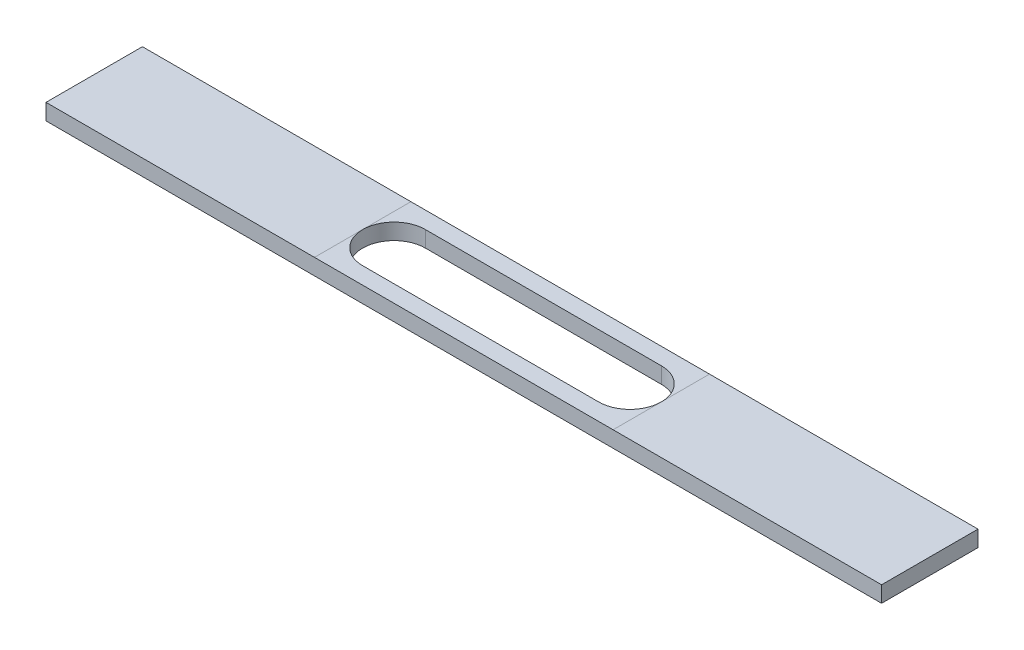
ISO-10303-21;
HEADER;
FILE_DESCRIPTION(('STEP AP214'),'2;1');
FILE_NAME('part.step','',(''),(''),'','','');
FILE_SCHEMA(('AUTOMOTIVE_DESIGN { 1 0 10303 214 1 1 1 1 }'));
ENDSEC;
DATA;
#1=APPLICATION_CONTEXT('core data for automotive mechanical design processes');
#2=APPLICATION_PROTOCOL_DEFINITION('international standard','automotive_design',2000,#1);
#3=PRODUCT_CONTEXT('',#1,'mechanical');
#4=PRODUCT('Part','Part','',(#3));
#5=PRODUCT_RELATED_PRODUCT_CATEGORY('part','',(#4));
#6=PRODUCT_DEFINITION_FORMATION('','',#4);
#7=PRODUCT_DEFINITION_CONTEXT('part definition',#1,'design');
#8=PRODUCT_DEFINITION('design','',#6,#7);
#9=PRODUCT_DEFINITION_SHAPE('','',#8);
#10=(LENGTH_UNIT() NAMED_UNIT(*) SI_UNIT(.MILLI.,.METRE.));
#11=(NAMED_UNIT(*) PLANE_ANGLE_UNIT() SI_UNIT($,.RADIAN.));
#12=(NAMED_UNIT(*) SI_UNIT($,.STERADIAN.) SOLID_ANGLE_UNIT());
#13=UNCERTAINTY_MEASURE_WITH_UNIT(LENGTH_MEASURE(1.E-05),#10,'distance_accuracy_value','');
#14=(GEOMETRIC_REPRESENTATION_CONTEXT(3) GLOBAL_UNCERTAINTY_ASSIGNED_CONTEXT((#13)) GLOBAL_UNIT_ASSIGNED_CONTEXT((#10,
#11,#12)) REPRESENTATION_CONTEXT('',''));
#15=CARTESIAN_POINT('',(0.,0.,0.));
#16=DIRECTION('',(0.,0.,1.));
#17=DIRECTION('',(1.,0.,0.));
#18=AXIS2_PLACEMENT_3D('',#15,#16,#17);
#19=CARTESIAN_POINT('',(0.,3.175,0.));
#20=DIRECTION('',(0.,1.,0.));
#21=DIRECTION('',(0.,0.,1.));
#22=AXIS2_PLACEMENT_3D('',#19,#20,#21);
#23=PLANE('',#22);
#24=DIRECTION('',(-1.,0.,0.));
#25=VECTOR('',#24,1.);
#26=CARTESIAN_POINT('',(-23.31,3.175,-6.19));
#27=LINE('',#26,#25);
#28=CARTESIAN_POINT('',(23.31,3.175,-6.19000000000001));
#29=VERTEX_POINT('',#28);
#30=CARTESIAN_POINT('',(-23.31,3.175,-6.19));
#31=VERTEX_POINT('',#30);
#32=EDGE_CURVE('E141',#29,#31,#27,.T.);
#33=ORIENTED_EDGE('',*,*,#32,.F.);
#34=CARTESIAN_POINT('',(23.31,3.175,0.));
#35=DIRECTION('',(0.,1.,0.));
#36=DIRECTION('',(0.,0.,1.));
#37=AXIS2_PLACEMENT_3D('',#34,#35,#36);
#38=CIRCLE('',#37,6.19);
#39=CARTESIAN_POINT('',(29.5,3.175,0.));
#40=VERTEX_POINT('',#39);
#41=EDGE_CURVE('E153',#40,#29,#38,.T.);
#42=ORIENTED_EDGE('',*,*,#41,.F.);
#43=DIRECTION('',(0.,0.,-1.));
#44=VECTOR('',#43,1.);
#45=CARTESIAN_POINT('',(29.5,3.175,0.));
#46=LINE('',#45,#44);
#47=CARTESIAN_POINT('',(29.5,3.175,-9.525));
#48=VERTEX_POINT('',#47);
#49=EDGE_CURVE('E48',#40,#48,#46,.T.);
#50=ORIENTED_EDGE('',*,*,#49,.T.);
#51=DIRECTION('',(-1.,0.,0.));
#52=VECTOR('',#51,1.);
#53=CARTESIAN_POINT('',(82.5500000000003,3.175,-9.52500000000001));
#54=LINE('',#53,#52);
#55=CARTESIAN_POINT('',(-29.5,3.175,-9.52499999999999));
#56=VERTEX_POINT('',#55);
#57=EDGE_CURVE('E171',#48,#56,#54,.T.);
#58=ORIENTED_EDGE('',*,*,#57,.T.);
#59=DIRECTION('',(0.,0.,-1.));
#60=VECTOR('',#59,1.);
#61=CARTESIAN_POINT('',(-29.5,3.175,0.));
#62=LINE('',#61,#60);
#63=CARTESIAN_POINT('',(-29.5,3.175,0.));
#64=VERTEX_POINT('',#63);
#65=EDGE_CURVE('E197',#64,#56,#62,.T.);
#66=ORIENTED_EDGE('',*,*,#65,.F.);
#67=CARTESIAN_POINT('',(-23.31,3.175,0.));
#68=DIRECTION('',(0.,1.,0.));
#69=DIRECTION('',(0.,0.,1.));
#70=AXIS2_PLACEMENT_3D('',#67,#68,#69);
#71=CIRCLE('',#70,6.19);
#72=EDGE_CURVE('E149',#31,#64,#71,.T.);
#73=ORIENTED_EDGE('',*,*,#72,.F.);
#74=EDGE_LOOP('',(#33,#42,#50,#58,#66,#73));
#75=FACE_BOUND('',#74,.T.);
#76=ADVANCED_FACE('F39',(#75),#23,.T.);
#77=CARTESIAN_POINT('',(-23.31,3.175,6.19));
#78=VERTEX_POINT('',#77);
#79=EDGE_CURVE('E128',#64,#78,#71,.T.);
#80=ORIENTED_EDGE('',*,*,#79,.F.);
#81=CARTESIAN_POINT('',(-29.5,3.175,9.52500000000001));
#82=VERTEX_POINT('',#81);
#83=EDGE_CURVE('E198',#82,#64,#62,.T.);
#84=ORIENTED_EDGE('',*,*,#83,.F.);
#85=DIRECTION('',(-1.,0.,0.));
#86=VECTOR('',#85,1.);
#87=CARTESIAN_POINT('',(82.5500000000003,3.175,9.525));
#88=LINE('',#87,#86);
#89=CARTESIAN_POINT('',(29.5,3.175,9.525));
#90=VERTEX_POINT('',#89);
#91=EDGE_CURVE('E179',#90,#82,#88,.T.);
#92=ORIENTED_EDGE('',*,*,#91,.F.);
#93=EDGE_CURVE('E11',#90,#40,#46,.T.);
#94=ORIENTED_EDGE('',*,*,#93,.T.);
#95=CARTESIAN_POINT('',(23.31,3.175,6.19));
#96=VERTEX_POINT('',#95);
#97=EDGE_CURVE('E144',#96,#40,#38,.T.);
#98=ORIENTED_EDGE('',*,*,#97,.F.);
#99=DIRECTION('',(1.,0.,0.));
#100=VECTOR('',#99,1.);
#101=CARTESIAN_POINT('',(-23.31,3.175,6.19));
#102=LINE('',#101,#100);
#103=EDGE_CURVE('E151',#78,#96,#102,.T.);
#104=ORIENTED_EDGE('',*,*,#103,.F.);
#105=EDGE_LOOP('',(#80,#84,#92,#94,#98,#104));
#106=FACE_BOUND('',#105,.T.);
#107=ADVANCED_FACE('F234',(#106),#23,.T.);
#108=CARTESIAN_POINT('',(-82.5499999999997,3.175,9.52500000000001));
#109=VERTEX_POINT('',#108);
#110=EDGE_CURVE('E174',#82,#109,#88,.T.);
#111=ORIENTED_EDGE('',*,*,#110,.F.);
#112=ORIENTED_EDGE('',*,*,#83,.T.);
#113=ORIENTED_EDGE('',*,*,#65,.T.);
#114=CARTESIAN_POINT('',(-82.5499999999997,3.175,-9.52499999999999));
#115=VERTEX_POINT('',#114);
#116=EDGE_CURVE('E165',#56,#115,#54,.T.);
#117=ORIENTED_EDGE('',*,*,#116,.T.);
#118=DIRECTION('',(0.,0.,-1.));
#119=VECTOR('',#118,1.);
#120=CARTESIAN_POINT('',(-82.5499999999997,3.175,9.52500000000001));
#121=LINE('',#120,#119);
#122=EDGE_CURVE('E170',#109,#115,#121,.T.);
#123=ORIENTED_EDGE('',*,*,#122,.F.);
#124=EDGE_LOOP('',(#111,#112,#113,#117,#123));
#125=FACE_BOUND('',#124,.T.);
#126=ADVANCED_FACE('F212',(#125),#23,.T.);
#127=CARTESIAN_POINT('',(82.5500000000003,3.175,9.525));
#128=DIRECTION('',(-1.,0.,0.));
#129=DIRECTION('',(0.,0.,1.));
#130=AXIS2_PLACEMENT_3D('',#127,#128,#129);
#131=PLANE('',#130);
#132=DIRECTION('',(0.,0.,-1.));
#133=VECTOR('',#132,1.);
#134=CARTESIAN_POINT('',(82.5500000000003,0.,9.525));
#135=LINE('',#134,#133);
#136=CARTESIAN_POINT('',(82.5500000000003,0.,9.525));
#137=VERTEX_POINT('',#136);
#138=CARTESIAN_POINT('',(82.5500000000003,0.,-9.52500000000001));
#139=VERTEX_POINT('',#138);
#140=EDGE_CURVE('E157',#137,#139,#135,.T.);
#141=ORIENTED_EDGE('',*,*,#140,.T.);
#142=DIRECTION('',(0.,-1.,0.));
#143=VECTOR('',#142,1.);
#144=CARTESIAN_POINT('',(82.5500000000003,3.175,-9.52500000000001));
#145=LINE('',#144,#143);
#146=CARTESIAN_POINT('',(82.5500000000003,3.175,-9.52500000000001));
#147=VERTEX_POINT('',#146);
#148=EDGE_CURVE('E195',#147,#139,#145,.T.);
#149=ORIENTED_EDGE('',*,*,#148,.F.);
#150=DIRECTION('',(0.,0.,-1.));
#151=VECTOR('',#150,1.);
#152=CARTESIAN_POINT('',(82.5500000000003,3.175,9.525));
#153=LINE('',#152,#151);
#154=CARTESIAN_POINT('',(82.5500000000003,3.175,9.525));
#155=VERTEX_POINT('',#154);
#156=EDGE_CURVE('E162',#155,#147,#153,.T.);
#157=ORIENTED_EDGE('',*,*,#156,.F.);
#158=DIRECTION('',(0.,-1.,0.));
#159=VECTOR('',#158,1.);
#160=CARTESIAN_POINT('',(82.5500000000003,3.175,9.525));
#161=LINE('',#160,#159);
#162=EDGE_CURVE('E178',#155,#137,#161,.T.);
#163=ORIENTED_EDGE('',*,*,#162,.T.);
#164=EDGE_LOOP('',(#141,#149,#157,#163));
#165=FACE_BOUND('',#164,.T.);
#166=ADVANCED_FACE('F41',(#165),#131,.F.);
#167=CARTESIAN_POINT('',(82.5500000000003,3.175,-9.52500000000001));
#168=DIRECTION('',(0.,0.,1.));
#169=DIRECTION('',(1.,0.,0.));
#170=AXIS2_PLACEMENT_3D('',#167,#168,#169);
#171=PLANE('',#170);
#172=DIRECTION('',(-1.,0.,0.));
#173=VECTOR('',#172,1.);
#174=CARTESIAN_POINT('',(82.5500000000003,0.,-9.52500000000001));
#175=LINE('',#174,#173);
#176=CARTESIAN_POINT('',(-82.5499999999997,0.,-9.52499999999999));
#177=VERTEX_POINT('',#176);
#178=EDGE_CURVE('E182',#139,#177,#175,.T.);
#179=ORIENTED_EDGE('',*,*,#178,.T.);
#180=DIRECTION('',(0.,-1.,0.));
#181=VECTOR('',#180,1.);
#182=CARTESIAN_POINT('',(-82.5499999999997,3.175,-9.52499999999999));
#183=LINE('',#182,#181);
#184=EDGE_CURVE('E193',#115,#177,#183,.T.);
#185=ORIENTED_EDGE('',*,*,#184,.F.);
#186=ORIENTED_EDGE('',*,*,#116,.F.);
#187=ORIENTED_EDGE('',*,*,#57,.F.);
#188=EDGE_CURVE('E167',#147,#48,#54,.T.);
#189=ORIENTED_EDGE('',*,*,#188,.F.);
#190=ORIENTED_EDGE('',*,*,#148,.T.);
#191=EDGE_LOOP('',(#179,#185,#186,#187,#189,#190));
#192=FACE_BOUND('',#191,.T.);
#193=ADVANCED_FACE('F223',(#192),#171,.F.);
#194=CARTESIAN_POINT('',(-82.5499999999997,3.175,9.52500000000001));
#195=DIRECTION('',(-1.,0.,0.));
#196=DIRECTION('',(0.,0.,1.));
#197=AXIS2_PLACEMENT_3D('',#194,#195,#196);
#198=PLANE('',#197);
#199=DIRECTION('',(0.,0.,-1.));
#200=VECTOR('',#199,1.);
#201=CARTESIAN_POINT('',(-82.5499999999997,0.,9.52500000000001));
#202=LINE('',#201,#200);
#203=CARTESIAN_POINT('',(-82.5499999999997,0.,9.52500000000001));
#204=VERTEX_POINT('',#203);
#205=EDGE_CURVE('E185',#204,#177,#202,.T.);
#206=ORIENTED_EDGE('',*,*,#205,.F.);
#207=DIRECTION('',(0.,-1.,0.));
#208=VECTOR('',#207,1.);
#209=CARTESIAN_POINT('',(-82.5499999999997,3.175,9.52500000000001));
#210=LINE('',#209,#208);
#211=EDGE_CURVE('E191',#109,#204,#210,.T.);
#212=ORIENTED_EDGE('',*,*,#211,.F.);
#213=ORIENTED_EDGE('',*,*,#122,.T.);
#214=ORIENTED_EDGE('',*,*,#184,.T.);
#215=EDGE_LOOP('',(#206,#212,#213,#214));
#216=FACE_BOUND('',#215,.T.);
#217=ADVANCED_FACE('F227',(#216),#198,.T.);
#218=CARTESIAN_POINT('',(82.5500000000003,3.175,9.525));
#219=DIRECTION('',(0.,0.,1.));
#220=DIRECTION('',(1.,0.,0.));
#221=AXIS2_PLACEMENT_3D('',#218,#219,#220);
#222=PLANE('',#221);
#223=DIRECTION('',(-1.,0.,0.));
#224=VECTOR('',#223,1.);
#225=CARTESIAN_POINT('',(82.5500000000003,0.,9.525));
#226=LINE('',#225,#224);
#227=EDGE_CURVE('E166',#137,#204,#226,.T.);
#228=ORIENTED_EDGE('',*,*,#227,.F.);
#229=ORIENTED_EDGE('',*,*,#162,.F.);
#230=EDGE_CURVE('E175',#155,#90,#88,.T.);
#231=ORIENTED_EDGE('',*,*,#230,.T.);
#232=ORIENTED_EDGE('',*,*,#91,.T.);
#233=ORIENTED_EDGE('',*,*,#110,.T.);
#234=ORIENTED_EDGE('',*,*,#211,.T.);
#235=EDGE_LOOP('',(#228,#229,#231,#232,#233,#234));
#236=FACE_BOUND('',#235,.T.);
#237=ADVANCED_FACE('F231',(#236),#222,.T.);
#238=ORIENTED_EDGE('',*,*,#93,.F.);
#239=ORIENTED_EDGE('',*,*,#230,.F.);
#240=ORIENTED_EDGE('',*,*,#156,.T.);
#241=ORIENTED_EDGE('',*,*,#188,.T.);
#242=ORIENTED_EDGE('',*,*,#49,.F.);
#243=EDGE_LOOP('',(#238,#239,#240,#241,#242));
#244=FACE_BOUND('',#243,.T.);
#245=ADVANCED_FACE('F238',(#244),#23,.T.);
#246=CARTESIAN_POINT('',(0.,0.,0.));
#247=DIRECTION('',(0.,1.,0.));
#248=DIRECTION('',(0.,0.,1.));
#249=AXIS2_PLACEMENT_3D('',#246,#247,#248);
#250=PLANE('',#249);
#251=DIRECTION('',(-1.,0.,0.));
#252=VECTOR('',#251,1.);
#253=CARTESIAN_POINT('',(-23.31,0.,-6.19));
#254=LINE('',#253,#252);
#255=CARTESIAN_POINT('',(23.31,0.,-6.19000000000001));
#256=VERTEX_POINT('',#255);
#257=CARTESIAN_POINT('',(-23.31,0.,-6.19));
#258=VERTEX_POINT('',#257);
#259=EDGE_CURVE('E131',#256,#258,#254,.T.);
#260=ORIENTED_EDGE('',*,*,#259,.T.);
#261=CARTESIAN_POINT('',(-23.31,0.,0.));
#262=DIRECTION('',(0.,1.,0.));
#263=DIRECTION('',(0.,0.,1.));
#264=AXIS2_PLACEMENT_3D('',#261,#262,#263);
#265=CIRCLE('',#264,6.19);
#266=CARTESIAN_POINT('',(-23.31,0.,6.19));
#267=VERTEX_POINT('',#266);
#268=EDGE_CURVE('E125',#258,#267,#265,.T.);
#269=ORIENTED_EDGE('',*,*,#268,.T.);
#270=DIRECTION('',(1.,0.,0.));
#271=VECTOR('',#270,1.);
#272=CARTESIAN_POINT('',(-23.31,0.,6.19));
#273=LINE('',#272,#271);
#274=CARTESIAN_POINT('',(23.31,0.,6.18999999999999));
#275=VERTEX_POINT('',#274);
#276=EDGE_CURVE('E134',#267,#275,#273,.T.);
#277=ORIENTED_EDGE('',*,*,#276,.T.);
#278=CARTESIAN_POINT('',(23.31,0.,0.));
#279=DIRECTION('',(0.,1.,0.));
#280=DIRECTION('',(0.,0.,1.));
#281=AXIS2_PLACEMENT_3D('',#278,#279,#280);
#282=CIRCLE('',#281,6.19);
#283=EDGE_CURVE('E63',#275,#256,#282,.T.);
#284=ORIENTED_EDGE('',*,*,#283,.T.);
#285=EDGE_LOOP('',(#260,#269,#277,#284));
#286=FACE_BOUND('',#285,.T.);
#287=ORIENTED_EDGE('',*,*,#140,.F.);
#288=ORIENTED_EDGE('',*,*,#227,.T.);
#289=ORIENTED_EDGE('',*,*,#205,.T.);
#290=ORIENTED_EDGE('',*,*,#178,.F.);
#291=EDGE_LOOP('',(#287,#288,#289,#290));
#292=FACE_BOUND('',#291,.T.);
#293=ADVANCED_FACE('F138',(#286,#292),#250,.F.);
#294=CARTESIAN_POINT('',(-23.31,0.,0.));
#295=DIRECTION('',(0.,1.,0.));
#296=DIRECTION('',(0.,0.,1.));
#297=AXIS2_PLACEMENT_3D('',#294,#295,#296);
#298=CYLINDRICAL_SURFACE('',#297,6.19);
#299=ORIENTED_EDGE('',*,*,#72,.T.);
#300=ORIENTED_EDGE('',*,*,#79,.T.);
#301=DIRECTION('',(0.,1.,0.));
#302=VECTOR('',#301,1.);
#303=CARTESIAN_POINT('',(-23.31,0.,6.19));
#304=LINE('',#303,#302);
#305=EDGE_CURVE('E55',#267,#78,#304,.T.);
#306=ORIENTED_EDGE('',*,*,#305,.F.);
#307=ORIENTED_EDGE('',*,*,#268,.F.);
#308=DIRECTION('',(0.,1.,0.));
#309=VECTOR('',#308,1.);
#310=CARTESIAN_POINT('',(-23.31,0.,-6.19));
#311=LINE('',#310,#309);
#312=EDGE_CURVE('E155',#258,#31,#311,.T.);
#313=ORIENTED_EDGE('',*,*,#312,.T.);
#314=EDGE_LOOP('',(#299,#300,#306,#307,#313));
#315=FACE_BOUND('',#314,.T.);
#316=ADVANCED_FACE('F123',(#315),#298,.F.);
#317=CARTESIAN_POINT('',(-23.31,0.,-6.19));
#318=DIRECTION('',(0.,0.,-1.));
#319=DIRECTION('',(-1.,0.,0.));
#320=AXIS2_PLACEMENT_3D('',#317,#318,#319);
#321=PLANE('',#320);
#322=ORIENTED_EDGE('',*,*,#32,.T.);
#323=ORIENTED_EDGE('',*,*,#312,.F.);
#324=ORIENTED_EDGE('',*,*,#259,.F.);
#325=DIRECTION('',(0.,1.,0.));
#326=VECTOR('',#325,1.);
#327=CARTESIAN_POINT('',(23.31,0.,-6.19000000000001));
#328=LINE('',#327,#326);
#329=EDGE_CURVE('E158',#256,#29,#328,.T.);
#330=ORIENTED_EDGE('',*,*,#329,.T.);
#331=EDGE_LOOP('',(#322,#323,#324,#330));
#332=FACE_BOUND('',#331,.T.);
#333=ADVANCED_FACE('F249',(#332),#321,.F.);
#334=CARTESIAN_POINT('',(23.31,0.,0.));
#335=DIRECTION('',(0.,1.,0.));
#336=DIRECTION('',(0.,0.,1.));
#337=AXIS2_PLACEMENT_3D('',#334,#335,#336);
#338=CYLINDRICAL_SURFACE('',#337,6.19);
#339=ORIENTED_EDGE('',*,*,#97,.T.);
#340=ORIENTED_EDGE('',*,*,#41,.T.);
#341=ORIENTED_EDGE('',*,*,#329,.F.);
#342=ORIENTED_EDGE('',*,*,#283,.F.);
#343=DIRECTION('',(0.,1.,0.));
#344=VECTOR('',#343,1.);
#345=CARTESIAN_POINT('',(23.31,0.,6.19));
#346=LINE('',#345,#344);
#347=EDGE_CURVE('E130',#275,#96,#346,.T.);
#348=ORIENTED_EDGE('',*,*,#347,.T.);
#349=EDGE_LOOP('',(#339,#340,#341,#342,#348));
#350=FACE_BOUND('',#349,.T.);
#351=ADVANCED_FACE('F236',(#350),#338,.F.);
#352=CARTESIAN_POINT('',(-23.31,0.,6.19));
#353=DIRECTION('',(0.,0.,1.));
#354=DIRECTION('',(1.,0.,0.));
#355=AXIS2_PLACEMENT_3D('',#352,#353,#354);
#356=PLANE('',#355);
#357=ORIENTED_EDGE('',*,*,#103,.T.);
#358=ORIENTED_EDGE('',*,*,#347,.F.);
#359=ORIENTED_EDGE('',*,*,#276,.F.);
#360=ORIENTED_EDGE('',*,*,#305,.T.);
#361=EDGE_LOOP('',(#357,#358,#359,#360));
#362=FACE_BOUND('',#361,.T.);
#363=ADVANCED_FACE('F135',(#362),#356,.F.);
#364=CLOSED_SHELL('',(#76,#107,#126,#166,#193,#217,#237,#245,#293,#316,#333,#351,#363));
#365=MANIFOLD_SOLID_BREP('B2',#364);
#366=ADVANCED_BREP_SHAPE_REPRESENTATION('',(#18,#365),#14);
#367=SHAPE_DEFINITION_REPRESENTATION(#9,#366);
ENDSEC;
END-ISO-10303-21;
